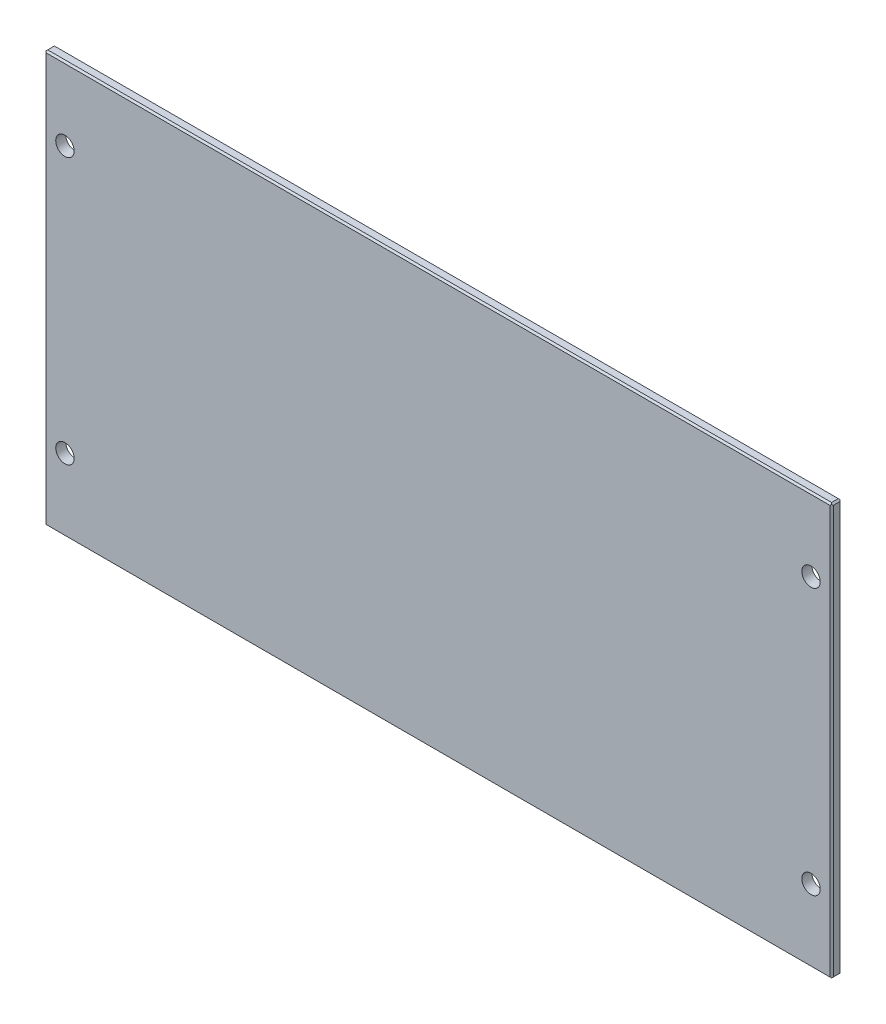
ISO-10303-21;
HEADER;
FILE_DESCRIPTION(('STEP AP214'),'2;1');
FILE_NAME('part.step','',(''),(''),'','','');
FILE_SCHEMA(('AUTOMOTIVE_DESIGN { 1 0 10303 214 1 1 1 1 }'));
ENDSEC;
DATA;
#1=APPLICATION_CONTEXT('core data for automotive mechanical design processes');
#2=APPLICATION_PROTOCOL_DEFINITION('international standard','automotive_design',2000,#1);
#3=PRODUCT_CONTEXT('',#1,'mechanical');
#4=PRODUCT('Part','Part','',(#3));
#5=PRODUCT_RELATED_PRODUCT_CATEGORY('part','',(#4));
#6=PRODUCT_DEFINITION_FORMATION('','',#4);
#7=PRODUCT_DEFINITION_CONTEXT('part definition',#1,'design');
#8=PRODUCT_DEFINITION('design','',#6,#7);
#9=PRODUCT_DEFINITION_SHAPE('','',#8);
#10=(LENGTH_UNIT() NAMED_UNIT(*) SI_UNIT(.MILLI.,.METRE.));
#11=(NAMED_UNIT(*) PLANE_ANGLE_UNIT() SI_UNIT($,.RADIAN.));
#12=(NAMED_UNIT(*) SI_UNIT($,.STERADIAN.) SOLID_ANGLE_UNIT());
#13=UNCERTAINTY_MEASURE_WITH_UNIT(LENGTH_MEASURE(1.E-05),#10,'distance_accuracy_value','');
#14=(GEOMETRIC_REPRESENTATION_CONTEXT(3) GLOBAL_UNCERTAINTY_ASSIGNED_CONTEXT((#13)) GLOBAL_UNIT_ASSIGNED_CONTEXT((#10,
#11,#12)) REPRESENTATION_CONTEXT('',''));
#15=CARTESIAN_POINT('',(0.,0.,0.));
#16=DIRECTION('',(0.,0.,1.));
#17=DIRECTION('',(1.,0.,0.));
#18=AXIS2_PLACEMENT_3D('',#15,#16,#17);
#19=CARTESIAN_POINT('',(117.565,61.4999999999992,2.99999999999934));
#20=DIRECTION('',(-1.,0.,0.));
#21=DIRECTION('',(0.,-1.,0.));
#22=AXIS2_PLACEMENT_3D('',#19,#20,#21);
#23=PLANE('',#22);
#24=DIRECTION('',(0.,-1.,0.));
#25=VECTOR('',#24,1.);
#26=CARTESIAN_POINT('',(117.565,-61.5000000000007,2.50000000000006));
#27=LINE('',#26,#25);
#28=CARTESIAN_POINT('',(117.565,61.0000000000001,2.50000000000006));
#29=VERTEX_POINT('',#28);
#30=CARTESIAN_POINT('',(117.565,-61.0000000000007,2.49999999999928));
#31=VERTEX_POINT('',#30);
#32=EDGE_CURVE('E212',#29,#31,#27,.T.);
#33=ORIENTED_EDGE('',*,*,#32,.T.);
#34=DIRECTION('',(0.,0.,-1.));
#35=VECTOR('',#34,1.);
#36=CARTESIAN_POINT('',(117.565,-61.,2.99999999999956));
#37=LINE('',#36,#35);
#38=CARTESIAN_POINT('',(117.565,-61.0000000000006,0.499999999999723));
#39=VERTEX_POINT('',#38);
#40=EDGE_CURVE('E266',#31,#39,#37,.T.);
#41=ORIENTED_EDGE('',*,*,#40,.T.);
#42=DIRECTION('',(0.,1.,0.));
#43=VECTOR('',#42,1.);
#44=CARTESIAN_POINT('',(117.565,61.5,0.500000000000056));
#45=LINE('',#44,#43);
#46=CARTESIAN_POINT('',(117.565,61.0000000000001,0.499999999999501));
#47=VERTEX_POINT('',#46);
#48=EDGE_CURVE('E209',#39,#47,#45,.T.);
#49=ORIENTED_EDGE('',*,*,#48,.T.);
#50=DIRECTION('',(0.,0.,1.));
#51=VECTOR('',#50,1.);
#52=CARTESIAN_POINT('',(117.565,61.0000000000001,3.00000000000045));
#53=LINE('',#52,#51);
#54=EDGE_CURVE('E264',#47,#29,#53,.T.);
#55=ORIENTED_EDGE('',*,*,#54,.T.);
#56=EDGE_LOOP('',(#33,#41,#49,#55));
#57=FACE_BOUND('',#56,.T.);
#58=ADVANCED_FACE('F43',(#57),#23,.F.);
#59=CARTESIAN_POINT('',(-117.565,61.4999999999996,2.99999999999878));
#60=DIRECTION('',(0.,-1.,0.));
#61=DIRECTION('',(0.,0.,-1.));
#62=AXIS2_PLACEMENT_3D('',#59,#60,#61);
#63=PLANE('',#62);
#64=DIRECTION('',(1.,0.,0.));
#65=VECTOR('',#64,1.);
#66=CARTESIAN_POINT('',(117.565,61.5000000000001,2.49999999999961));
#67=LINE('',#66,#65);
#68=CARTESIAN_POINT('',(-117.065,61.5,2.49999999999961));
#69=VERTEX_POINT('',#68);
#70=CARTESIAN_POINT('',(117.065,61.5000000000001,2.49999999999961));
#71=VERTEX_POINT('',#70);
#72=EDGE_CURVE('E206',#69,#71,#67,.T.);
#73=ORIENTED_EDGE('',*,*,#72,.T.);
#74=DIRECTION('',(0.,0.,-1.));
#75=VECTOR('',#74,1.);
#76=CARTESIAN_POINT('',(117.065,61.4999999999992,2.99999999999934));
#77=LINE('',#76,#75);
#78=CARTESIAN_POINT('',(117.065,61.5,0.500000000000056));
#79=VERTEX_POINT('',#78);
#80=EDGE_CURVE('E279',#71,#79,#77,.T.);
#81=ORIENTED_EDGE('',*,*,#80,.T.);
#82=DIRECTION('',(-1.,0.,0.));
#83=VECTOR('',#82,1.);
#84=CARTESIAN_POINT('',(-117.565,61.5,0.500000000000278));
#85=LINE('',#84,#83);
#86=CARTESIAN_POINT('',(-117.065,61.5,0.500000000000278));
#87=VERTEX_POINT('',#86);
#88=EDGE_CURVE('E204',#79,#87,#85,.T.);
#89=ORIENTED_EDGE('',*,*,#88,.T.);
#90=DIRECTION('',(0.,0.,1.));
#91=VECTOR('',#90,1.);
#92=CARTESIAN_POINT('',(-117.065,61.4999999999996,2.99999999999878));
#93=LINE('',#92,#91);
#94=EDGE_CURVE('E277',#87,#69,#93,.T.);
#95=ORIENTED_EDGE('',*,*,#94,.T.);
#96=EDGE_LOOP('',(#73,#81,#89,#95));
#97=FACE_BOUND('',#96,.T.);
#98=ADVANCED_FACE('F377',(#97),#63,.F.);
#99=CARTESIAN_POINT('',(-117.565,61.4999999999996,2.99999999999878));
#100=DIRECTION('',(1.,0.,0.));
#101=DIRECTION('',(0.,1.,0.));
#102=AXIS2_PLACEMENT_3D('',#99,#100,#101);
#103=PLANE('',#102);
#104=DIRECTION('',(0.,-1.,0.));
#105=VECTOR('',#104,1.);
#106=CARTESIAN_POINT('',(-117.565,61.5,0.500000000000278));
#107=LINE('',#106,#105);
#108=CARTESIAN_POINT('',(-117.565,61.0000000000003,0.499999999999945));
#109=VERTEX_POINT('',#108);
#110=CARTESIAN_POINT('',(-117.565,-61.0000000000006,0.499999999999723));
#111=VERTEX_POINT('',#110);
#112=EDGE_CURVE('E198',#109,#111,#107,.T.);
#113=ORIENTED_EDGE('',*,*,#112,.T.);
#114=DIRECTION('',(0.,0.,1.));
#115=VECTOR('',#114,1.);
#116=CARTESIAN_POINT('',(-117.565,-61.,2.99999999999967));
#117=LINE('',#116,#115);
#118=CARTESIAN_POINT('',(-117.565,-61.0000000000006,2.49999999999939));
#119=VERTEX_POINT('',#118);
#120=EDGE_CURVE('E255',#111,#119,#117,.T.);
#121=ORIENTED_EDGE('',*,*,#120,.T.);
#122=DIRECTION('',(0.,1.,0.));
#123=VECTOR('',#122,1.);
#124=CARTESIAN_POINT('',(-117.565,61.5000000000001,2.49999999999939));
#125=LINE('',#124,#123);
#126=CARTESIAN_POINT('',(-117.565,61.0000000000002,2.49999999999984));
#127=VERTEX_POINT('',#126);
#128=EDGE_CURVE('E201',#119,#127,#125,.T.);
#129=ORIENTED_EDGE('',*,*,#128,.T.);
#130=DIRECTION('',(0.,0.,-1.));
#131=VECTOR('',#130,1.);
#132=CARTESIAN_POINT('',(-117.565,61.0000000000001,3.000000000001));
#133=LINE('',#132,#131);
#134=EDGE_CURVE('E252',#127,#109,#133,.T.);
#135=ORIENTED_EDGE('',*,*,#134,.T.);
#136=EDGE_LOOP('',(#113,#121,#129,#135));
#137=FACE_BOUND('',#136,.T.);
#138=ADVANCED_FACE('F296',(#137),#103,.F.);
#139=CARTESIAN_POINT('',(-117.565,-61.5000000000002,3.00000000000056));
#140=DIRECTION('',(0.,1.,0.));
#141=DIRECTION('',(0.,0.,1.));
#142=AXIS2_PLACEMENT_3D('',#139,#140,#141);
#143=PLANE('',#142);
#144=DIRECTION('',(-1.,0.,0.));
#145=VECTOR('',#144,1.);
#146=CARTESIAN_POINT('',(-117.565,-61.5000000000007,2.50000000000006));
#147=LINE('',#146,#145);
#148=CARTESIAN_POINT('',(117.065,-61.5000000000007,2.50000000000006));
#149=VERTEX_POINT('',#148);
#150=CARTESIAN_POINT('',(-117.065,-61.5000000000007,2.50000000000028));
#151=VERTEX_POINT('',#150);
#152=EDGE_CURVE('E191',#149,#151,#147,.T.);
#153=ORIENTED_EDGE('',*,*,#152,.T.);
#154=DIRECTION('',(0.,0.,-1.));
#155=VECTOR('',#154,1.);
#156=CARTESIAN_POINT('',(-117.065,-61.5000000000002,3.00000000000056));
#157=LINE('',#156,#155);
#158=CARTESIAN_POINT('',(-117.065,-61.5000000000001,0.500000000000722));
#159=VERTEX_POINT('',#158);
#160=EDGE_CURVE('E241',#151,#159,#157,.T.);
#161=ORIENTED_EDGE('',*,*,#160,.T.);
#162=DIRECTION('',(1.,0.,0.));
#163=VECTOR('',#162,1.);
#164=CARTESIAN_POINT('',(-117.565,-61.5000000000001,0.500000000000722));
#165=LINE('',#164,#163);
#166=CARTESIAN_POINT('',(117.065,-61.5,0.500000000000278));
#167=VERTEX_POINT('',#166);
#168=EDGE_CURVE('E188',#159,#167,#165,.T.);
#169=ORIENTED_EDGE('',*,*,#168,.T.);
#170=DIRECTION('',(0.,0.,1.));
#171=VECTOR('',#170,1.);
#172=CARTESIAN_POINT('',(117.065,-61.5000000000001,2.99999999999989));
#173=LINE('',#172,#171);
#174=EDGE_CURVE('E224',#167,#149,#173,.T.);
#175=ORIENTED_EDGE('',*,*,#174,.T.);
#176=EDGE_LOOP('',(#153,#161,#169,#175));
#177=FACE_BOUND('',#176,.T.);
#178=ADVANCED_FACE('F311',(#177),#143,.F.);
#179=CARTESIAN_POINT('',(0.,-3.33066907387547E-13,3.00000000000011));
#180=DIRECTION('',(0.,0.,1.));
#181=DIRECTION('',(1.,0.,0.));
#182=AXIS2_PLACEMENT_3D('',#179,#180,#181);
#183=PLANE('',#182);
#184=DIRECTION('',(0.,-1.,0.));
#185=VECTOR('',#184,1.);
#186=CARTESIAN_POINT('',(-117.065,-61.5000000000002,3.00000000000056));
#187=LINE('',#186,#185);
#188=CARTESIAN_POINT('',(-117.065,61.0000000000001,3.000000000001));
#189=VERTEX_POINT('',#188);
#190=CARTESIAN_POINT('',(-117.065,-61.,2.99999999999967));
#191=VERTEX_POINT('',#190);
#192=EDGE_CURVE('E186',#189,#191,#187,.T.);
#193=ORIENTED_EDGE('',*,*,#192,.T.);
#194=DIRECTION('',(1.,0.,0.));
#195=VECTOR('',#194,1.);
#196=CARTESIAN_POINT('',(117.565,-61.0000000000001,2.99999999999956));
#197=LINE('',#196,#195);
#198=CARTESIAN_POINT('',(117.065,-61.0000000000001,2.99999999999956));
#199=VERTEX_POINT('',#198);
#200=EDGE_CURVE('E164',#191,#199,#197,.T.);
#201=ORIENTED_EDGE('',*,*,#200,.T.);
#202=DIRECTION('',(0.,1.,0.));
#203=VECTOR('',#202,1.);
#204=CARTESIAN_POINT('',(117.065,61.4999999999992,2.99999999999934));
#205=LINE('',#204,#203);
#206=CARTESIAN_POINT('',(117.065,61.0000000000001,3.00000000000045));
#207=VERTEX_POINT('',#206);
#208=EDGE_CURVE('E174',#199,#207,#205,.T.);
#209=ORIENTED_EDGE('',*,*,#208,.T.);
#210=DIRECTION('',(-1.,0.,0.));
#211=VECTOR('',#210,1.);
#212=CARTESIAN_POINT('',(-117.565,61.0000000000001,3.000000000001));
#213=LINE('',#212,#211);
#214=EDGE_CURVE('E180',#207,#189,#213,.T.);
#215=ORIENTED_EDGE('',*,*,#214,.T.);
#216=EDGE_LOOP('',(#193,#201,#209,#215));
#217=FACE_BOUND('',#216,.T.);
#218=CARTESIAN_POINT('',(111.415,39.7499999999998,2.99999999999911));
#219=DIRECTION('',(0.,0.,1.));
#220=DIRECTION('',(-1.,0.,0.));
#221=AXIS2_PLACEMENT_3D('',#218,#219,#220);
#222=CIRCLE('',#221,2.75000000000001);
#223=CARTESIAN_POINT('',(108.665,39.7499999999998,2.99999999999911));
#224=VERTEX_POINT('',#223);
#225=EDGE_CURVE('E337',#224,#224,#222,.T.);
#226=ORIENTED_EDGE('',*,*,#225,.F.);
#227=EDGE_LOOP('',(#226));
#228=FACE_BOUND('',#227,.T.);
#229=CARTESIAN_POINT('',(111.415,-39.7500000000003,2.99999999999845));
#230=DIRECTION('',(0.,0.,1.));
#231=DIRECTION('',(1.,0.,0.));
#232=AXIS2_PLACEMENT_3D('',#229,#230,#231);
#233=CIRCLE('',#232,2.75000000000001);
#234=CARTESIAN_POINT('',(114.165,-39.7500000000003,2.99999999999845));
#235=VERTEX_POINT('',#234);
#236=EDGE_CURVE('E343',#235,#235,#233,.T.);
#237=ORIENTED_EDGE('',*,*,#236,.F.);
#238=EDGE_LOOP('',(#237));
#239=FACE_BOUND('',#238,.T.);
#240=CARTESIAN_POINT('',(-111.415,-39.7500000000001,2.99999999999834));
#241=DIRECTION('',(0.,0.,1.));
#242=DIRECTION('',(-1.,0.,0.));
#243=AXIS2_PLACEMENT_3D('',#240,#241,#242);
#244=CIRCLE('',#243,2.75000000000001);
#245=CARTESIAN_POINT('',(-114.165,-39.7500000000001,2.99999999999834));
#246=VERTEX_POINT('',#245);
#247=EDGE_CURVE('E332',#246,#246,#244,.T.);
#248=ORIENTED_EDGE('',*,*,#247,.F.);
#249=EDGE_LOOP('',(#248));
#250=FACE_BOUND('',#249,.T.);
#251=CARTESIAN_POINT('',(-111.415,39.75,2.999999999999));
#252=DIRECTION('',(0.,0.,1.));
#253=DIRECTION('',(1.,0.,0.));
#254=AXIS2_PLACEMENT_3D('',#251,#252,#253);
#255=CIRCLE('',#254,2.75000000000001);
#256=CARTESIAN_POINT('',(-108.665,39.75,2.999999999999));
#257=VERTEX_POINT('',#256);
#258=EDGE_CURVE('E329',#257,#257,#255,.T.);
#259=ORIENTED_EDGE('',*,*,#258,.F.);
#260=EDGE_LOOP('',(#259));
#261=FACE_BOUND('',#260,.T.);
#262=ADVANCED_FACE('F183',(#217,#228,#239,#250,#261),#183,.T.);
#263=CARTESIAN_POINT('',(0.,0.,0.));
#264=DIRECTION('',(0.,0.,1.));
#265=DIRECTION('',(1.,0.,0.));
#266=AXIS2_PLACEMENT_3D('',#263,#264,#265);
#267=PLANE('',#266);
#268=DIRECTION('',(0.,1.,0.));
#269=VECTOR('',#268,1.);
#270=CARTESIAN_POINT('',(-117.065,0.,0.));
#271=LINE('',#270,#269);
#272=CARTESIAN_POINT('',(-117.065,-61.0000000000001,-2.22044604925031E-13));
#273=VERTEX_POINT('',#272);
#274=CARTESIAN_POINT('',(-117.065,61.,-7.7715611723761E-13));
#275=VERTEX_POINT('',#274);
#276=EDGE_CURVE('E220',#273,#275,#271,.T.);
#277=ORIENTED_EDGE('',*,*,#276,.T.);
#278=DIRECTION('',(1.,0.,0.));
#279=VECTOR('',#278,1.);
#280=CARTESIAN_POINT('',(0.,61.,5.55111512312578E-13));
#281=LINE('',#280,#279);
#282=CARTESIAN_POINT('',(117.065,61.,-4.44089209850063E-13));
#283=VERTEX_POINT('',#282);
#284=EDGE_CURVE('E222',#275,#283,#281,.T.);
#285=ORIENTED_EDGE('',*,*,#284,.T.);
#286=DIRECTION('',(0.,-1.,0.));
#287=VECTOR('',#286,1.);
#288=CARTESIAN_POINT('',(117.065,-4.44089209850063E-13,-5.55111512312578E-13));
#289=LINE('',#288,#287);
#290=CARTESIAN_POINT('',(117.065,-61.0000000000003,-2.22044604925031E-13));
#291=VERTEX_POINT('',#290);
#292=EDGE_CURVE('E215',#283,#291,#289,.T.);
#293=ORIENTED_EDGE('',*,*,#292,.T.);
#294=DIRECTION('',(-1.,0.,0.));
#295=VECTOR('',#294,1.);
#296=CARTESIAN_POINT('',(1.94289029309402E-13,-61.0000000000002,-6.66133814775094E-13));
#297=LINE('',#296,#295);
#298=EDGE_CURVE('E218',#291,#273,#297,.T.);
#299=ORIENTED_EDGE('',*,*,#298,.T.);
#300=EDGE_LOOP('',(#277,#285,#293,#299));
#301=FACE_BOUND('',#300,.T.);
#302=CARTESIAN_POINT('',(111.415,39.75,-8.88178419700125E-13));
#303=DIRECTION('',(0.,0.,1.));
#304=DIRECTION('',(-1.,0.,0.));
#305=AXIS2_PLACEMENT_3D('',#302,#303,#304);
#306=CIRCLE('',#305,2.75000000000001);
#307=CARTESIAN_POINT('',(108.665,39.75,-8.88108018641694E-13));
#308=VERTEX_POINT('',#307);
#309=EDGE_CURVE('E231',#308,#308,#306,.T.);
#310=ORIENTED_EDGE('',*,*,#309,.T.);
#311=EDGE_LOOP('',(#310));
#312=FACE_BOUND('',#311,.T.);
#313=CARTESIAN_POINT('',(111.415,-39.7500000000005,-5.55111512312578E-13));
#314=DIRECTION('',(0.,0.,1.));
#315=DIRECTION('',(1.,0.,0.));
#316=AXIS2_PLACEMENT_3D('',#313,#314,#315);
#317=CIRCLE('',#316,2.75000000000001);
#318=CARTESIAN_POINT('',(114.165,-39.7500000000005,-5.55181913371009E-13));
#319=VERTEX_POINT('',#318);
#320=EDGE_CURVE('E340',#319,#319,#317,.T.);
#321=ORIENTED_EDGE('',*,*,#320,.T.);
#322=EDGE_LOOP('',(#321));
#323=FACE_BOUND('',#322,.T.);
#324=CARTESIAN_POINT('',(-111.415,-39.7500000000005,-3.33066907387547E-13));
#325=DIRECTION('',(0.,0.,1.));
#326=DIRECTION('',(-1.,0.,0.));
#327=AXIS2_PLACEMENT_3D('',#324,#325,#326);
#328=CIRCLE('',#327,2.75000000000001);
#329=CARTESIAN_POINT('',(-114.165,-39.7500000000005,-3.32996506329116E-13));
#330=VERTEX_POINT('',#329);
#331=EDGE_CURVE('E346',#330,#330,#328,.T.);
#332=ORIENTED_EDGE('',*,*,#331,.T.);
#333=EDGE_LOOP('',(#332));
#334=FACE_BOUND('',#333,.T.);
#335=CARTESIAN_POINT('',(-111.415,39.75,-6.66133814775094E-13));
#336=DIRECTION('',(0.,0.,1.));
#337=DIRECTION('',(1.,0.,0.));
#338=AXIS2_PLACEMENT_3D('',#335,#336,#337);
#339=CIRCLE('',#338,2.75000000000001);
#340=CARTESIAN_POINT('',(-108.665,39.75,-6.66204215833525E-13));
#341=VERTEX_POINT('',#340);
#342=EDGE_CURVE('E181',#341,#341,#339,.T.);
#343=ORIENTED_EDGE('',*,*,#342,.T.);
#344=EDGE_LOOP('',(#343));
#345=FACE_BOUND('',#344,.T.);
#346=ADVANCED_FACE('F356',(#301,#312,#323,#334,#345),#267,.F.);
#347=CARTESIAN_POINT('',(-111.415,39.75,-6.66133814775094E-13));
#348=DIRECTION('',(0.,0.,1.));
#349=DIRECTION('',(1.,0.,0.));
#350=AXIS2_PLACEMENT_3D('',#347,#348,#349);
#351=CYLINDRICAL_SURFACE('',#350,2.75000000000001);
#352=ORIENTED_EDGE('',*,*,#342,.F.);
#353=EDGE_LOOP('',(#352));
#354=FACE_BOUND('',#353,.T.);
#355=ORIENTED_EDGE('',*,*,#258,.T.);
#356=EDGE_LOOP('',(#355));
#357=FACE_BOUND('',#356,.T.);
#358=ADVANCED_FACE('F360',(#354,#357),#351,.F.);
#359=CARTESIAN_POINT('',(-111.415,-39.7500000000005,-3.33066907387547E-13));
#360=DIRECTION('',(0.,0.,1.));
#361=DIRECTION('',(1.,0.,0.));
#362=AXIS2_PLACEMENT_3D('',#359,#360,#361);
#363=CYLINDRICAL_SURFACE('',#362,2.75000000000001);
#364=ORIENTED_EDGE('',*,*,#331,.F.);
#365=EDGE_LOOP('',(#364));
#366=FACE_BOUND('',#365,.T.);
#367=ORIENTED_EDGE('',*,*,#247,.T.);
#368=EDGE_LOOP('',(#367));
#369=FACE_BOUND('',#368,.T.);
#370=ADVANCED_FACE('F352',(#366,#369),#363,.F.);
#371=CARTESIAN_POINT('',(111.415,-39.7500000000005,-5.55111512312578E-13));
#372=DIRECTION('',(0.,0.,1.));
#373=DIRECTION('',(1.,0.,0.));
#374=AXIS2_PLACEMENT_3D('',#371,#372,#373);
#375=CYLINDRICAL_SURFACE('',#374,2.75000000000001);
#376=ORIENTED_EDGE('',*,*,#320,.F.);
#377=EDGE_LOOP('',(#376));
#378=FACE_BOUND('',#377,.T.);
#379=ORIENTED_EDGE('',*,*,#236,.T.);
#380=EDGE_LOOP('',(#379));
#381=FACE_BOUND('',#380,.T.);
#382=ADVANCED_FACE('F369',(#378,#381),#375,.F.);
#383=CARTESIAN_POINT('',(111.415,39.75,-8.88178419700125E-13));
#384=DIRECTION('',(0.,0.,1.));
#385=DIRECTION('',(1.,0.,0.));
#386=AXIS2_PLACEMENT_3D('',#383,#384,#385);
#387=CYLINDRICAL_SURFACE('',#386,2.75000000000001);
#388=ORIENTED_EDGE('',*,*,#309,.F.);
#389=EDGE_LOOP('',(#388));
#390=FACE_BOUND('',#389,.T.);
#391=ORIENTED_EDGE('',*,*,#225,.T.);
#392=EDGE_LOOP('',(#391));
#393=FACE_BOUND('',#392,.T.);
#394=ADVANCED_FACE('F408',(#390,#393),#387,.F.);
#395=CARTESIAN_POINT('',(2.77555756156289E-13,61.0000000000001,3.000000000001));
#396=DIRECTION('',(0.,0.707106781186529,0.707106781186567));
#397=DIRECTION('',(1.,0.,0.));
#398=AXIS2_PLACEMENT_3D('',#395,#396,#397);
#399=PLANE('',#398);
#400=DIRECTION('',(-0.577350269189637,-0.57735026918964,0.577350269189605));
#401=VECTOR('',#400,1.);
#402=CARTESIAN_POINT('',(96.731666666666,40.666666666666,23.3333333333314));
#403=LINE('',#402,#401);
#404=CARTESIAN_POINT('',(117.315,61.2500000000003,2.74999999999936));
#405=VERTEX_POINT('',#404);
#406=EDGE_CURVE('E177',#405,#207,#403,.T.);
#407=ORIENTED_EDGE('',*,*,#406,.F.);
#408=DIRECTION('',(0.577350269189636,-0.577350269189638,0.577350269189604));
#409=VECTOR('',#408,1.);
#410=CARTESIAN_POINT('',(78.3766666666653,100.188333333335,-36.1883333333333));
#411=LINE('',#410,#409);
#412=EDGE_CURVE('E11',#405,#71,#411,.F.);
#413=ORIENTED_EDGE('',*,*,#412,.T.);
#414=ORIENTED_EDGE('',*,*,#72,.F.);
#415=DIRECTION('',(0.577350269189658,0.577350269189627,-0.577350269189594));
#416=VECTOR('',#415,1.);
#417=CARTESIAN_POINT('',(-78.3766666666622,100.188333333336,-36.1883333333342));
#418=LINE('',#417,#416);
#419=CARTESIAN_POINT('',(-117.315,61.2500000000006,2.74999999999914));
#420=VERTEX_POINT('',#419);
#421=EDGE_CURVE('E52',#69,#420,#418,.F.);
#422=ORIENTED_EDGE('',*,*,#421,.T.);
#423=DIRECTION('',(0.577350269189636,-0.577350269189638,0.577350269189604));
#424=VECTOR('',#423,1.);
#425=CARTESIAN_POINT('',(-78.0433333333319,21.9783333333318,42.0216666666648));
#426=LINE('',#425,#424);
#427=EDGE_CURVE('E228',#189,#420,#426,.F.);
#428=ORIENTED_EDGE('',*,*,#427,.F.);
#429=ORIENTED_EDGE('',*,*,#214,.F.);
#430=EDGE_LOOP('',(#407,#413,#414,#422,#428,#429));
#431=FACE_BOUND('',#430,.T.);
#432=ADVANCED_FACE('F286',(#431),#399,.T.);
#433=CARTESIAN_POINT('',(-117.065,0.,2.99999999999989));
#434=DIRECTION('',(-0.707106781186528,0.,0.707106781186567));
#435=DIRECTION('',(0.,1.,0.));
#436=AXIS2_PLACEMENT_3D('',#433,#434,#435);
#437=PLANE('',#436);
#438=ORIENTED_EDGE('',*,*,#128,.F.);
#439=DIRECTION('',(-0.577350269189636,0.577350269189638,-0.577350269189604));
#440=VECTOR('',#439,1.);
#441=CARTESIAN_POINT('',(-137.565000000001,-40.9999999999993,-17.5000000000007));
#442=LINE('',#441,#440);
#443=CARTESIAN_POINT('',(-117.315,-61.2500000000001,2.74999999999981));
#444=VERTEX_POINT('',#443);
#445=EDGE_CURVE('E259',#119,#444,#442,.F.);
#446=ORIENTED_EDGE('',*,*,#445,.T.);
#447=DIRECTION('',(0.577350269189636,0.577350269189638,0.577350269189604));
#448=VECTOR('',#447,1.);
#449=CARTESIAN_POINT('',(-96.7316666666659,-40.6666666666664,23.3333333333324));
#450=LINE('',#449,#448);
#451=EDGE_CURVE('E170',#191,#444,#450,.F.);
#452=ORIENTED_EDGE('',*,*,#451,.F.);
#453=ORIENTED_EDGE('',*,*,#192,.F.);
#454=ORIENTED_EDGE('',*,*,#427,.T.);
#455=DIRECTION('',(0.577350269189647,0.577350269189617,0.577350269189615));
#456=VECTOR('',#455,1.);
#457=CARTESIAN_POINT('',(-137.565,41.0000000000009,-17.5000000000001));
#458=LINE('',#457,#456);
#459=EDGE_CURVE('E257',#420,#127,#458,.F.);
#460=ORIENTED_EDGE('',*,*,#459,.T.);
#461=EDGE_LOOP('',(#438,#446,#452,#453,#454,#460));
#462=FACE_BOUND('',#461,.T.);
#463=ADVANCED_FACE('F292',(#462),#437,.T.);
#464=CARTESIAN_POINT('',(117.065,-5.27355936696949E-13,2.99999999999956));
#465=DIRECTION('',(0.707106781186528,0.,0.707106781186567));
#466=DIRECTION('',(0.,-1.,0.));
#467=AXIS2_PLACEMENT_3D('',#464,#465,#466);
#468=PLANE('',#467);
#469=DIRECTION('',(0.577350269189637,-0.577350269189637,-0.577350269189604));
#470=VECTOR('',#469,1.);
#471=CARTESIAN_POINT('',(96.7316666666661,-40.6666666666665,23.333333333332));
#472=LINE('',#471,#470);
#473=CARTESIAN_POINT('',(117.315,-61.2500000000003,2.74999999999936));
#474=VERTEX_POINT('',#473);
#475=EDGE_CURVE('E159',#474,#199,#472,.F.);
#476=ORIENTED_EDGE('',*,*,#475,.F.);
#477=DIRECTION('',(-0.577350269189648,-0.577350269189617,0.577350269189616));
#478=VECTOR('',#477,1.);
#479=CARTESIAN_POINT('',(137.564999999999,-41.0000000000013,-17.4999999999996));
#480=LINE('',#479,#478);
#481=EDGE_CURVE('E275',#474,#31,#480,.F.);
#482=ORIENTED_EDGE('',*,*,#481,.T.);
#483=ORIENTED_EDGE('',*,*,#32,.F.);
#484=DIRECTION('',(0.577350269189637,-0.577350269189637,-0.577350269189604));
#485=VECTOR('',#484,1.);
#486=CARTESIAN_POINT('',(137.565,40.9999999999992,-17.5000000000001));
#487=LINE('',#486,#485);
#488=EDGE_CURVE('E273',#29,#405,#487,.F.);
#489=ORIENTED_EDGE('',*,*,#488,.T.);
#490=ORIENTED_EDGE('',*,*,#406,.T.);
#491=ORIENTED_EDGE('',*,*,#208,.F.);
#492=EDGE_LOOP('',(#476,#482,#483,#489,#490,#491));
#493=FACE_BOUND('',#492,.T.);
#494=ADVANCED_FACE('F175',(#493),#468,.T.);
#495=CARTESIAN_POINT('',(1.38777878078145E-13,-61.0000000000002,3.00000000000089));
#496=DIRECTION('',(0.,-0.707106781186532,0.707106781186567));
#497=DIRECTION('',(-1.,0.,0.));
#498=AXIS2_PLACEMENT_3D('',#495,#496,#497);
#499=PLANE('',#498);
#500=ORIENTED_EDGE('',*,*,#451,.T.);
#501=DIRECTION('',(-0.577350269189636,0.577350269189637,0.577350269189604));
#502=VECTOR('',#501,1.);
#503=CARTESIAN_POINT('',(-78.376666666665,-100.188333333335,-36.1883333333336));
#504=LINE('',#503,#502);
#505=EDGE_CURVE('E262',#444,#151,#504,.F.);
#506=ORIENTED_EDGE('',*,*,#505,.T.);
#507=ORIENTED_EDGE('',*,*,#152,.F.);
#508=DIRECTION('',(-0.577350269189658,-0.577350269189627,-0.577350269189593));
#509=VECTOR('',#508,1.);
#510=CARTESIAN_POINT('',(78.3766666666625,-100.188333333336,-36.1883333333348));
#511=LINE('',#510,#509);
#512=EDGE_CURVE('E167',#149,#474,#511,.F.);
#513=ORIENTED_EDGE('',*,*,#512,.T.);
#514=ORIENTED_EDGE('',*,*,#475,.T.);
#515=ORIENTED_EDGE('',*,*,#200,.F.);
#516=EDGE_LOOP('',(#500,#506,#507,#513,#514,#515));
#517=FACE_BOUND('',#516,.T.);
#518=ADVANCED_FACE('F162',(#517),#499,.T.);
#519=CARTESIAN_POINT('',(-117.565,-61.5000000000001,0.500000000000722));
#520=DIRECTION('',(0.,0.707106781186569,0.707106781186528));
#521=DIRECTION('',(1.,0.,0.));
#522=AXIS2_PLACEMENT_3D('',#519,#520,#521);
#523=PLANE('',#522);
#524=ORIENTED_EDGE('',*,*,#168,.F.);
#525=DIRECTION('',(-0.577350269189615,0.577350269189617,-0.577350269189647));
#526=VECTOR('',#525,1.);
#527=CARTESIAN_POINT('',(-117.231666666667,-61.3333333333337,0.333333333333519));
#528=LINE('',#527,#526);
#529=CARTESIAN_POINT('',(-117.315,-61.2500000000002,0.249999999998973));
#530=VERTEX_POINT('',#529);
#531=EDGE_CURVE('E246',#159,#530,#528,.T.);
#532=ORIENTED_EDGE('',*,*,#531,.T.);
#533=DIRECTION('',(0.577350269189615,0.577350269189617,-0.577350269189647));
#534=VECTOR('',#533,1.);
#535=CARTESIAN_POINT('',(-117.565,-61.5000000000001,0.500000000000722));
#536=LINE('',#535,#534);
#537=EDGE_CURVE('E236',#273,#530,#536,.F.);
#538=ORIENTED_EDGE('',*,*,#537,.F.);
#539=ORIENTED_EDGE('',*,*,#298,.F.);
#540=DIRECTION('',(-0.577350269189615,0.577350269189617,-0.577350269189647));
#541=VECTOR('',#540,1.);
#542=CARTESIAN_POINT('',(76.5650000000019,-20.5000000000015,-40.5000000000009));
#543=LINE('',#542,#541);
#544=CARTESIAN_POINT('',(117.315,-61.2500000000006,0.249999999998973));
#545=VERTEX_POINT('',#544);
#546=EDGE_CURVE('E171',#545,#291,#543,.T.);
#547=ORIENTED_EDGE('',*,*,#546,.F.);
#548=DIRECTION('',(-0.577350269189637,-0.577350269189607,0.577350269189636));
#549=VECTOR('',#548,1.);
#550=CARTESIAN_POINT('',(38.8549999999967,-139.709999999999,78.7100000000019));
#551=LINE('',#550,#549);
#552=EDGE_CURVE('E244',#545,#167,#551,.T.);
#553=ORIENTED_EDGE('',*,*,#552,.T.);
#554=EDGE_LOOP('',(#524,#532,#538,#539,#547,#553));
#555=FACE_BOUND('',#554,.T.);
#556=ADVANCED_FACE('F314',(#555),#523,.F.);
#557=CARTESIAN_POINT('',(117.565,61.5,0.500000000000056));
#558=DIRECTION('',(-0.707106781186567,0.,0.707106781186527));
#559=DIRECTION('',(0.,1.,0.));
#560=AXIS2_PLACEMENT_3D('',#557,#558,#559);
#561=PLANE('',#560);
#562=ORIENTED_EDGE('',*,*,#48,.F.);
#563=DIRECTION('',(-0.577350269189626,-0.577350269189597,-0.577350269189656));
#564=VECTOR('',#563,1.);
#565=CARTESIAN_POINT('',(158.398333333331,-20.1666666666718,41.3333333333326));
#566=LINE('',#565,#564);
#567=EDGE_CURVE('E271',#39,#545,#566,.T.);
#568=ORIENTED_EDGE('',*,*,#567,.T.);
#569=ORIENTED_EDGE('',*,*,#546,.T.);
#570=ORIENTED_EDGE('',*,*,#292,.F.);
#571=DIRECTION('',(0.577350269189615,0.577350269189617,0.577350269189646));
#572=VECTOR('',#571,1.);
#573=CARTESIAN_POINT('',(117.565,61.5,0.500000000000056));
#574=LINE('',#573,#572);
#575=CARTESIAN_POINT('',(117.315,61.2500000000003,0.249999999999417));
#576=VERTEX_POINT('',#575);
#577=EDGE_CURVE('E234',#576,#283,#574,.F.);
#578=ORIENTED_EDGE('',*,*,#577,.F.);
#579=DIRECTION('',(0.577350269189615,-0.577350269189617,0.577350269189647));
#580=VECTOR('',#579,1.);
#581=CARTESIAN_POINT('',(117.398333333333,61.1666666666658,0.333333333333408));
#582=LINE('',#581,#580);
#583=EDGE_CURVE('E269',#576,#47,#582,.T.);
#584=ORIENTED_EDGE('',*,*,#583,.T.);
#585=EDGE_LOOP('',(#562,#568,#569,#570,#578,#584));
#586=FACE_BOUND('',#585,.T.);
#587=ADVANCED_FACE('F420',(#586),#561,.F.);
#588=CARTESIAN_POINT('',(-117.565,61.5,0.500000000000278));
#589=DIRECTION('',(0.707106781186567,0.,0.707106781186528));
#590=DIRECTION('',(0.,-1.,0.));
#591=AXIS2_PLACEMENT_3D('',#588,#589,#590);
#592=PLANE('',#591);
#593=ORIENTED_EDGE('',*,*,#537,.T.);
#594=DIRECTION('',(-0.577350269189615,0.577350269189616,0.577350269189646));
#595=VECTOR('',#594,1.);
#596=CARTESIAN_POINT('',(-158.398333333332,-20.1666666666684,41.3333333333342));
#597=LINE('',#596,#595);
#598=EDGE_CURVE('E250',#530,#111,#597,.T.);
#599=ORIENTED_EDGE('',*,*,#598,.T.);
#600=ORIENTED_EDGE('',*,*,#112,.F.);
#601=DIRECTION('',(0.577350269189626,0.577350269189596,-0.577350269189658));
#602=VECTOR('',#601,1.);
#603=CARTESIAN_POINT('',(-117.398333333333,61.1666666666667,0.33333333333363));
#604=LINE('',#603,#602);
#605=CARTESIAN_POINT('',(-117.315,61.2500000000008,0.249999999999084));
#606=VERTEX_POINT('',#605);
#607=EDGE_CURVE('E248',#109,#606,#604,.T.);
#608=ORIENTED_EDGE('',*,*,#607,.T.);
#609=DIRECTION('',(0.577350269189615,-0.577350269189616,-0.577350269189646));
#610=VECTOR('',#609,1.);
#611=CARTESIAN_POINT('',(-117.565,61.5,0.500000000000278));
#612=LINE('',#611,#610);
#613=EDGE_CURVE('E232',#275,#606,#612,.F.);
#614=ORIENTED_EDGE('',*,*,#613,.F.);
#615=ORIENTED_EDGE('',*,*,#276,.F.);
#616=EDGE_LOOP('',(#593,#599,#600,#608,#614,#615));
#617=FACE_BOUND('',#616,.T.);
#618=ADVANCED_FACE('F299',(#617),#592,.F.);
#619=CARTESIAN_POINT('',(-117.565,61.5,0.500000000000278));
#620=DIRECTION('',(0.,-0.707106781186571,0.707106781186528));
#621=DIRECTION('',(-1.,0.,0.));
#622=AXIS2_PLACEMENT_3D('',#619,#620,#621);
#623=PLANE('',#622);
#624=ORIENTED_EDGE('',*,*,#88,.F.);
#625=DIRECTION('',(0.577350269189615,-0.577350269189616,-0.577350269189646));
#626=VECTOR('',#625,1.);
#627=CARTESIAN_POINT('',(38.8550000000032,139.709999999997,78.7100000000009));
#628=LINE('',#627,#626);
#629=EDGE_CURVE('E67',#79,#576,#628,.T.);
#630=ORIENTED_EDGE('',*,*,#629,.T.);
#631=ORIENTED_EDGE('',*,*,#577,.T.);
#632=ORIENTED_EDGE('',*,*,#284,.F.);
#633=ORIENTED_EDGE('',*,*,#613,.T.);
#634=DIRECTION('',(0.577350269189637,0.577350269189606,0.577350269189635));
#635=VECTOR('',#634,1.);
#636=CARTESIAN_POINT('',(-117.231666666667,61.3333333333333,0.333333333333075));
#637=LINE('',#636,#635);
#638=EDGE_CURVE('E59',#606,#87,#637,.T.);
#639=ORIENTED_EDGE('',*,*,#638,.T.);
#640=EDGE_LOOP('',(#624,#630,#631,#632,#633,#639));
#641=FACE_BOUND('',#640,.T.);
#642=ADVANCED_FACE('F409',(#641),#623,.F.);
#643=CARTESIAN_POINT('',(-117.065,-61.5000000000002,3.00000000000056));
#644=DIRECTION('',(0.707106781186548,0.70710678118655,0.));
#645=DIRECTION('',(0.,0.,-1.));
#646=AXIS2_PLACEMENT_3D('',#643,#644,#645);
#647=PLANE('',#646);
#648=ORIENTED_EDGE('',*,*,#445,.F.);
#649=ORIENTED_EDGE('',*,*,#120,.F.);
#650=ORIENTED_EDGE('',*,*,#598,.F.);
#651=ORIENTED_EDGE('',*,*,#531,.F.);
#652=ORIENTED_EDGE('',*,*,#160,.F.);
#653=ORIENTED_EDGE('',*,*,#505,.F.);
#654=EDGE_LOOP('',(#648,#649,#650,#651,#652,#653));
#655=FACE_BOUND('',#654,.T.);
#656=ADVANCED_FACE('F306',(#655),#647,.F.);
#657=CARTESIAN_POINT('',(117.565,-61.,2.99999999999956));
#658=DIRECTION('',(-0.707106781186527,0.707106781186569,0.));
#659=DIRECTION('',(0.,0.,-1.));
#660=AXIS2_PLACEMENT_3D('',#657,#658,#659);
#661=PLANE('',#660);
#662=ORIENTED_EDGE('',*,*,#512,.F.);
#663=ORIENTED_EDGE('',*,*,#174,.F.);
#664=ORIENTED_EDGE('',*,*,#552,.F.);
#665=ORIENTED_EDGE('',*,*,#567,.F.);
#666=ORIENTED_EDGE('',*,*,#40,.F.);
#667=ORIENTED_EDGE('',*,*,#481,.F.);
#668=EDGE_LOOP('',(#662,#663,#664,#665,#666,#667));
#669=FACE_BOUND('',#668,.T.);
#670=ADVANCED_FACE('F319',(#669),#661,.F.);
#671=CARTESIAN_POINT('',(117.065,61.4999999999992,2.99999999999934));
#672=DIRECTION('',(-0.707106781186548,-0.70710678118655,0.));
#673=DIRECTION('',(0.,0.,-1.));
#674=AXIS2_PLACEMENT_3D('',#671,#672,#673);
#675=PLANE('',#674);
#676=ORIENTED_EDGE('',*,*,#488,.F.);
#677=ORIENTED_EDGE('',*,*,#54,.F.);
#678=ORIENTED_EDGE('',*,*,#583,.F.);
#679=ORIENTED_EDGE('',*,*,#629,.F.);
#680=ORIENTED_EDGE('',*,*,#80,.F.);
#681=ORIENTED_EDGE('',*,*,#412,.F.);
#682=EDGE_LOOP('',(#676,#677,#678,#679,#680,#681));
#683=FACE_BOUND('',#682,.T.);
#684=ADVANCED_FACE('F326',(#683),#675,.F.);
#685=CARTESIAN_POINT('',(-117.565,61.0000000000001,3.000000000001));
#686=DIRECTION('',(0.707106781186527,-0.707106781186569,0.));
#687=DIRECTION('',(0.,0.,-1.));
#688=AXIS2_PLACEMENT_3D('',#685,#686,#687);
#689=PLANE('',#688);
#690=ORIENTED_EDGE('',*,*,#421,.F.);
#691=ORIENTED_EDGE('',*,*,#94,.F.);
#692=ORIENTED_EDGE('',*,*,#638,.F.);
#693=ORIENTED_EDGE('',*,*,#607,.F.);
#694=ORIENTED_EDGE('',*,*,#134,.F.);
#695=ORIENTED_EDGE('',*,*,#459,.F.);
#696=EDGE_LOOP('',(#690,#691,#692,#693,#694,#695));
#697=FACE_BOUND('',#696,.T.);
#698=ADVANCED_FACE('F46',(#697),#689,.F.);
#699=CLOSED_SHELL('',(#58,#98,#138,#178,#262,#346,#358,#370,#382,#394,#432,#463,#494,#518,#556,
#587,#618,#642,#656,#670,#684,#698));
#700=MANIFOLD_SOLID_BREP('B2',#699);
#701=ADVANCED_BREP_SHAPE_REPRESENTATION('',(#18,#700),#14);
#702=SHAPE_DEFINITION_REPRESENTATION(#9,#701);
ENDSEC;
END-ISO-10303-21;
